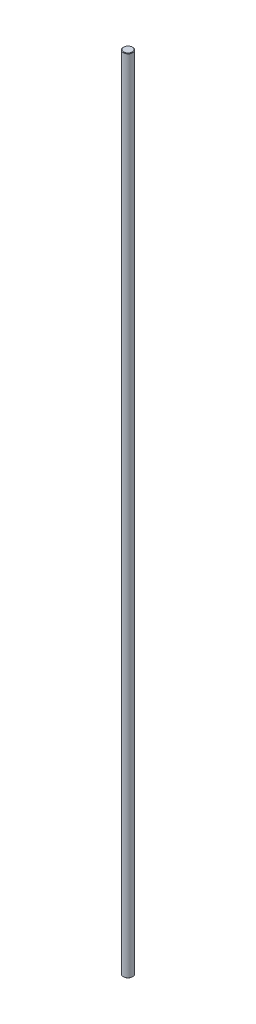
ISO-10303-21;
HEADER;
FILE_DESCRIPTION(('STEP AP214'),'2;1');
FILE_NAME('part.step','',(''),(''),'','','');
FILE_SCHEMA(('AUTOMOTIVE_DESIGN { 1 0 10303 214 1 1 1 1 }'));
ENDSEC;
DATA;
#1=APPLICATION_CONTEXT('core data for automotive mechanical design processes');
#2=APPLICATION_PROTOCOL_DEFINITION('international standard','automotive_design',2000,#1);
#3=PRODUCT_CONTEXT('',#1,'mechanical');
#4=PRODUCT('Part','Part','',(#3));
#5=PRODUCT_RELATED_PRODUCT_CATEGORY('part','',(#4));
#6=PRODUCT_DEFINITION_FORMATION('','',#4);
#7=PRODUCT_DEFINITION_CONTEXT('part definition',#1,'design');
#8=PRODUCT_DEFINITION('design','',#6,#7);
#9=PRODUCT_DEFINITION_SHAPE('','',#8);
#10=(LENGTH_UNIT() NAMED_UNIT(*) SI_UNIT(.MILLI.,.METRE.));
#11=(NAMED_UNIT(*) PLANE_ANGLE_UNIT() SI_UNIT($,.RADIAN.));
#12=(NAMED_UNIT(*) SI_UNIT($,.STERADIAN.) SOLID_ANGLE_UNIT());
#13=UNCERTAINTY_MEASURE_WITH_UNIT(LENGTH_MEASURE(1.E-05),#10,'distance_accuracy_value','');
#14=(GEOMETRIC_REPRESENTATION_CONTEXT(3) GLOBAL_UNCERTAINTY_ASSIGNED_CONTEXT((#13)) GLOBAL_UNIT_ASSIGNED_CONTEXT((#10,
#11,#12)) REPRESENTATION_CONTEXT('',''));
#15=CARTESIAN_POINT('',(0.,0.,0.));
#16=DIRECTION('',(0.,0.,1.));
#17=DIRECTION('',(1.,0.,0.));
#18=AXIS2_PLACEMENT_3D('',#15,#16,#17);
#19=CARTESIAN_POINT('',(0.,423.,0.));
#20=DIRECTION('',(0.,-1.,0.));
#21=DIRECTION('',(0.,0.,-1.));
#22=AXIS2_PLACEMENT_3D('',#19,#20,#21);
#23=CYLINDRICAL_SURFACE('',#22,2.5);
#24=CARTESIAN_POINT('',(0.,0.250000000000306,0.));
#25=DIRECTION('',(0.,1.,0.));
#26=DIRECTION('',(0.,0.,1.));
#27=AXIS2_PLACEMENT_3D('',#24,#25,#26);
#28=CIRCLE('',#27,2.5);
#29=CARTESIAN_POINT('',(0.,0.250000000000306,-2.5));
#30=VERTEX_POINT('',#29);
#31=EDGE_CURVE('E42',#30,#30,#28,.T.);
#32=CARTESIAN_POINT('',(0.,422.75,0.));
#33=DIRECTION('',(0.,1.,0.));
#34=DIRECTION('',(0.,0.,1.));
#35=AXIS2_PLACEMENT_3D('',#32,#33,#34);
#36=CIRCLE('',#35,2.5);
#37=CARTESIAN_POINT('',(0.,422.75,-2.5));
#38=VERTEX_POINT('',#37);
#39=EDGE_CURVE('E46',#38,#38,#36,.F.);
#40=CARTESIAN_POINT('',(0.,0.250000000000306,-2.5));
#41=CARTESIAN_POINT('',(0.,4.65104166666697,-2.5));
#42=CARTESIAN_POINT('',(0.,9.05208333333363,-2.5));
#43=CARTESIAN_POINT('',(0.,17.854166666667,-2.5));
#44=CARTESIAN_POINT('',(0.,22.2552083333336,-2.5));
#45=CARTESIAN_POINT('',(0.,31.057291666667,-2.5));
#46=CARTESIAN_POINT('',(0.,35.4583333333336,-2.5));
#47=CARTESIAN_POINT('',(0.,44.260416666667,-2.5));
#48=CARTESIAN_POINT('',(0.,48.6614583333337,-2.5));
#49=CARTESIAN_POINT('',(0.,57.463541666667,-2.5));
#50=CARTESIAN_POINT('',(0.,61.8645833333337,-2.5));
#51=CARTESIAN_POINT('',(0.,70.666666666667,-2.5));
#52=CARTESIAN_POINT('',(0.,75.0677083333337,-2.5));
#53=CARTESIAN_POINT('',(0.,83.869791666667,-2.5));
#54=CARTESIAN_POINT('',(0.,88.2708333333336,-2.5));
#55=CARTESIAN_POINT('',(0.,97.072916666667,-2.5));
#56=CARTESIAN_POINT('',(0.,101.473958333334,-2.5));
#57=CARTESIAN_POINT('',(0.,110.276041666667,-2.5));
#58=CARTESIAN_POINT('',(0.,114.677083333334,-2.5));
#59=CARTESIAN_POINT('',(0.,123.479166666667,-2.5));
#60=CARTESIAN_POINT('',(0.,127.880208333334,-2.5));
#61=CARTESIAN_POINT('',(0.,136.682291666667,-2.5));
#62=CARTESIAN_POINT('',(0.,141.083333333334,-2.5));
#63=CARTESIAN_POINT('',(0.,149.885416666667,-2.5));
#64=CARTESIAN_POINT('',(0.,154.286458333334,-2.5));
#65=CARTESIAN_POINT('',(0.,163.088541666667,-2.5));
#66=CARTESIAN_POINT('',(0.,167.489583333334,-2.5));
#67=CARTESIAN_POINT('',(0.,176.291666666667,-2.5));
#68=CARTESIAN_POINT('',(0.,180.692708333334,-2.5));
#69=CARTESIAN_POINT('',(0.,189.494791666667,-2.5));
#70=CARTESIAN_POINT('',(0.,193.895833333334,-2.5));
#71=CARTESIAN_POINT('',(0.,202.697916666667,-2.5));
#72=CARTESIAN_POINT('',(0.,207.098958333334,-2.5));
#73=CARTESIAN_POINT('',(0.,215.901041666667,-2.5));
#74=CARTESIAN_POINT('',(0.,220.302083333334,-2.5));
#75=CARTESIAN_POINT('',(0.,229.104166666667,-2.5));
#76=CARTESIAN_POINT('',(0.,233.505208333334,-2.5));
#77=CARTESIAN_POINT('',(0.,242.307291666667,-2.5));
#78=CARTESIAN_POINT('',(0.,246.708333333334,-2.5));
#79=CARTESIAN_POINT('',(0.,255.510416666667,-2.5));
#80=CARTESIAN_POINT('',(0.,259.911458333334,-2.5));
#81=CARTESIAN_POINT('',(0.,268.713541666667,-2.5));
#82=CARTESIAN_POINT('',(0.,273.114583333334,-2.5));
#83=CARTESIAN_POINT('',(0.,281.916666666667,-2.5));
#84=CARTESIAN_POINT('',(0.,286.317708333334,-2.5));
#85=CARTESIAN_POINT('',(0.,295.119791666667,-2.5));
#86=CARTESIAN_POINT('',(0.,299.520833333334,-2.5));
#87=CARTESIAN_POINT('',(0.,308.322916666667,-2.5));
#88=CARTESIAN_POINT('',(0.,312.723958333334,-2.5));
#89=CARTESIAN_POINT('',(0.,321.526041666667,-2.5));
#90=CARTESIAN_POINT('',(0.,325.927083333334,-2.5));
#91=CARTESIAN_POINT('',(0.,334.729166666667,-2.5));
#92=CARTESIAN_POINT('',(0.,339.130208333334,-2.5));
#93=CARTESIAN_POINT('',(0.,347.932291666667,-2.5));
#94=CARTESIAN_POINT('',(0.,352.333333333334,-2.5));
#95=CARTESIAN_POINT('',(0.,361.135416666667,-2.5));
#96=CARTESIAN_POINT('',(0.,365.536458333334,-2.5));
#97=CARTESIAN_POINT('',(0.,374.338541666667,-2.5));
#98=CARTESIAN_POINT('',(0.,378.739583333334,-2.5));
#99=CARTESIAN_POINT('',(0.,387.541666666667,-2.5));
#100=CARTESIAN_POINT('',(0.,391.942708333334,-2.5));
#101=CARTESIAN_POINT('',(0.,400.744791666667,-2.5));
#102=CARTESIAN_POINT('',(0.,405.145833333334,-2.5));
#103=CARTESIAN_POINT('',(0.,413.947916666667,-2.5));
#104=CARTESIAN_POINT('',(0.,418.348958333334,-2.5));
#105=CARTESIAN_POINT('',(0.,422.75,-2.5));
#106=B_SPLINE_CURVE_WITH_KNOTS('',3,(#40,#41,#42,#43,#44,#45,#46,#47,#48,#49,#50,#51,#52,#53,
#54,#55,#56,#57,#58,#59,#60,#61,#62,#63,#64,#65,#66,#67,#68,#69,#70,#71,#72,#73,#74,#75,#76,#77,
#78,#79,#80,#81,#82,#83,#84,#85,#86,#87,#88,#89,#90,#91,#92,#93,#94,#95,#96,#97,#98,#99,#100,
#101,#102,#103,#104,#105),.UNSPECIFIED.,.F.,.F.,(4,2,2,2,2,2,2,2,2,2,2,2,2,2,2,2,2,2,2,2,2,2,2,
2,2,2,2,2,2,2,2,2,4),(0.,13.203125,26.40625,39.609375,52.8125,66.015625,79.21875,92.421875,
105.625,118.828125,132.03125,145.234375,158.4375,171.640625,184.84375,198.046875,211.25,
224.453125,237.65625,250.859375,264.0625,277.265625,290.46875,303.671875,316.875,330.078125,
343.28125,356.484375,369.6875,382.890625,396.09375,409.296875,422.5),.UNSPECIFIED.);
#107=EDGE_CURVE('BSEAM31',#30,#38,#106,.T.);
#108=ORIENTED_EDGE('',*,*,#31,.T.);
#109=ORIENTED_EDGE('',*,*,#39,.T.);
#110=ORIENTED_EDGE('',*,*,#107,.T.);
#111=ORIENTED_EDGE('',*,*,#107,.F.);
#112=EDGE_LOOP('',(#108,#110,#109,#111));
#113=FACE_BOUND('',#112,.T.);
#114=ADVANCED_FACE('F31',(#113),#23,.T.);
#115=CARTESIAN_POINT('',(0.,423.,0.));
#116=DIRECTION('',(0.,1.,0.));
#117=DIRECTION('',(0.,0.,1.));
#118=AXIS2_PLACEMENT_3D('',#115,#116,#117);
#119=PLANE('',#118);
#120=CARTESIAN_POINT('',(0.,423.,0.));
#121=DIRECTION('',(0.,1.,0.));
#122=DIRECTION('',(0.,0.,1.));
#123=AXIS2_PLACEMENT_3D('',#120,#121,#122);
#124=CIRCLE('',#123,2.25000000000036);
#125=CARTESIAN_POINT('',(0.,423.,2.25000000000036));
#126=VERTEX_POINT('',#125);
#127=EDGE_CURVE('E10',#126,#126,#124,.T.);
#128=ORIENTED_EDGE('',*,*,#127,.T.);
#129=EDGE_LOOP('',(#128));
#130=FACE_BOUND('',#129,.T.);
#131=ADVANCED_FACE('F62',(#130),#119,.T.);
#132=CARTESIAN_POINT('',(0.,0.,0.));
#133=DIRECTION('',(0.,1.,0.));
#134=DIRECTION('',(0.,0.,1.));
#135=AXIS2_PLACEMENT_3D('',#132,#133,#134);
#136=PLANE('',#135);
#137=CARTESIAN_POINT('',(0.,0.,0.));
#138=DIRECTION('',(0.,1.,0.));
#139=DIRECTION('',(0.,0.,1.));
#140=AXIS2_PLACEMENT_3D('',#137,#138,#139);
#141=CIRCLE('',#140,2.24999999999964);
#142=CARTESIAN_POINT('',(0.,0.,2.24999999999964));
#143=VERTEX_POINT('',#142);
#144=EDGE_CURVE('E38',#143,#143,#141,.F.);
#145=ORIENTED_EDGE('',*,*,#144,.T.);
#146=EDGE_LOOP('',(#145));
#147=FACE_BOUND('',#146,.T.);
#148=ADVANCED_FACE('F59',(#147),#136,.F.);
#149=CARTESIAN_POINT('',(0.,0.250000000000306,0.));
#150=DIRECTION('',(0.,1.,0.));
#151=DIRECTION('',(0.,0.,1.));
#152=AXIS2_PLACEMENT_3D('',#149,#150,#151);
#153=CONICAL_SURFACE('',#152,2.5,0.785398163397557);
#154=ORIENTED_EDGE('',*,*,#144,.F.);
#155=EDGE_LOOP('',(#154));
#156=FACE_BOUND('',#155,.T.);
#157=ORIENTED_EDGE('',*,*,#31,.F.);
#158=EDGE_LOOP('',(#157));
#159=FACE_BOUND('',#158,.T.);
#160=ADVANCED_FACE('F55',(#156,#159),#153,.T.);
#161=CARTESIAN_POINT('',(0.,423.,0.));
#162=DIRECTION('',(0.,-1.,0.));
#163=DIRECTION('',(0.,0.,-1.));
#164=AXIS2_PLACEMENT_3D('',#161,#162,#163);
#165=CONICAL_SURFACE('',#164,2.25000000000036,0.785398163397446);
#166=ORIENTED_EDGE('',*,*,#39,.F.);
#167=EDGE_LOOP('',(#166));
#168=FACE_BOUND('',#167,.T.);
#169=ORIENTED_EDGE('',*,*,#127,.F.);
#170=EDGE_LOOP('',(#169));
#171=FACE_BOUND('',#170,.T.);
#172=ADVANCED_FACE('F33',(#168,#171),#165,.T.);
#173=CLOSED_SHELL('',(#114,#131,#148,#160,#172));
#174=MANIFOLD_SOLID_BREP('B2',#173);
#175=ADVANCED_BREP_SHAPE_REPRESENTATION('',(#18,#174),#14);
#176=SHAPE_DEFINITION_REPRESENTATION(#9,#175);
ENDSEC;
END-ISO-10303-21;
